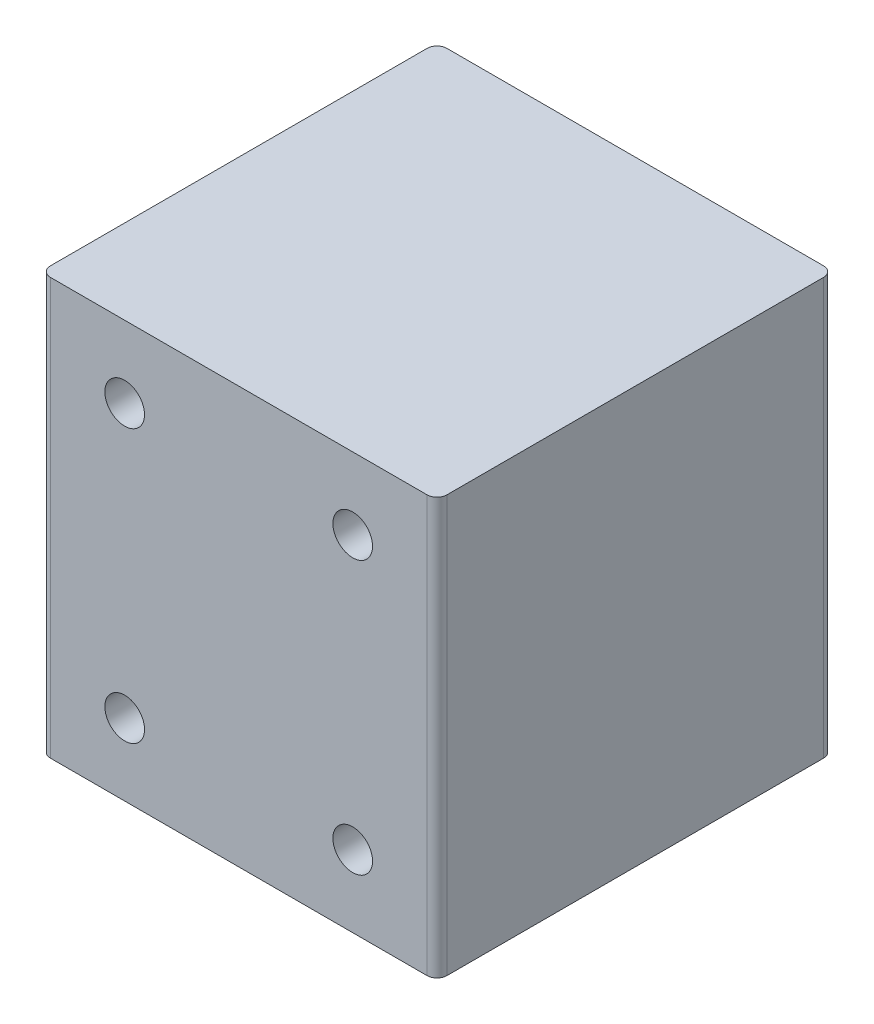
ISO-10303-21;
HEADER;
FILE_DESCRIPTION(('STEP AP214'),'2;1');
FILE_NAME('part.step','',(''),(''),'','','');
FILE_SCHEMA(('AUTOMOTIVE_DESIGN { 1 0 10303 214 1 1 1 1 }'));
ENDSEC;
DATA;
#1=APPLICATION_CONTEXT('core data for automotive mechanical design processes');
#2=APPLICATION_PROTOCOL_DEFINITION('international standard','automotive_design',2000,#1);
#3=PRODUCT_CONTEXT('',#1,'mechanical');
#4=PRODUCT('Part','Part','',(#3));
#5=PRODUCT_RELATED_PRODUCT_CATEGORY('part','',(#4));
#6=PRODUCT_DEFINITION_FORMATION('','',#4);
#7=PRODUCT_DEFINITION_CONTEXT('part definition',#1,'design');
#8=PRODUCT_DEFINITION('design','',#6,#7);
#9=PRODUCT_DEFINITION_SHAPE('','',#8);
#10=(LENGTH_UNIT() NAMED_UNIT(*) SI_UNIT(.MILLI.,.METRE.));
#11=(NAMED_UNIT(*) PLANE_ANGLE_UNIT() SI_UNIT($,.RADIAN.));
#12=(NAMED_UNIT(*) SI_UNIT($,.STERADIAN.) SOLID_ANGLE_UNIT());
#13=UNCERTAINTY_MEASURE_WITH_UNIT(LENGTH_MEASURE(1.E-05),#10,'distance_accuracy_value','');
#14=(GEOMETRIC_REPRESENTATION_CONTEXT(3) GLOBAL_UNCERTAINTY_ASSIGNED_CONTEXT((#13)) GLOBAL_UNIT_ASSIGNED_CONTEXT((#10,
#11,#12)) REPRESENTATION_CONTEXT('',''));
#15=CARTESIAN_POINT('',(0.,0.,0.));
#16=DIRECTION('',(0.,0.,1.));
#17=DIRECTION('',(1.,0.,0.));
#18=AXIS2_PLACEMENT_3D('',#15,#16,#17);
#19=CARTESIAN_POINT('',(40.,84.,40.));
#20=DIRECTION('',(-1.,0.,0.));
#21=DIRECTION('',(0.,0.,1.));
#22=AXIS2_PLACEMENT_3D('',#19,#20,#21);
#23=PLANE('',#22);
#24=DIRECTION('',(0.,0.,-1.));
#25=VECTOR('',#24,1.);
#26=CARTESIAN_POINT('',(40.,0.,40.));
#27=LINE('',#26,#25);
#28=CARTESIAN_POINT('',(40.,0.,38.));
#29=VERTEX_POINT('',#28);
#30=CARTESIAN_POINT('',(40.,0.,-38.));
#31=VERTEX_POINT('',#30);
#32=EDGE_CURVE('E201',#29,#31,#27,.T.);
#33=ORIENTED_EDGE('',*,*,#32,.T.);
#34=DIRECTION('',(0.,-1.,0.));
#35=VECTOR('',#34,1.);
#36=CARTESIAN_POINT('',(40.,84.,-38.));
#37=LINE('',#36,#35);
#38=CARTESIAN_POINT('',(40.,84.,-38.));
#39=VERTEX_POINT('',#38);
#40=EDGE_CURVE('E253',#31,#39,#37,.F.);
#41=ORIENTED_EDGE('',*,*,#40,.T.);
#42=DIRECTION('',(0.,0.,-1.));
#43=VECTOR('',#42,1.);
#44=CARTESIAN_POINT('',(40.,84.,40.));
#45=LINE('',#44,#43);
#46=CARTESIAN_POINT('',(40.,84.,38.));
#47=VERTEX_POINT('',#46);
#48=EDGE_CURVE('E202',#47,#39,#45,.T.);
#49=ORIENTED_EDGE('',*,*,#48,.F.);
#50=DIRECTION('',(0.,-1.,0.));
#51=VECTOR('',#50,1.);
#52=CARTESIAN_POINT('',(40.,84.,38.));
#53=LINE('',#52,#51);
#54=EDGE_CURVE('E249',#47,#29,#53,.T.);
#55=ORIENTED_EDGE('',*,*,#54,.T.);
#56=EDGE_LOOP('',(#33,#41,#49,#55));
#57=FACE_BOUND('',#56,.T.);
#58=ADVANCED_FACE('F40',(#57),#23,.F.);
#59=CARTESIAN_POINT('',(-40.,84.,-40.));
#60=DIRECTION('',(0.,0.,1.));
#61=DIRECTION('',(1.,0.,0.));
#62=AXIS2_PLACEMENT_3D('',#59,#60,#61);
#63=PLANE('',#62);
#64=CARTESIAN_POINT('',(-23.,69.5,-40.));
#65=DIRECTION('',(0.,0.,-1.));
#66=DIRECTION('',(-1.,0.,0.));
#67=AXIS2_PLACEMENT_3D('',#64,#65,#66);
#68=CIRCLE('',#67,3.99999999999999);
#69=CARTESIAN_POINT('',(-27.,69.5,-40.));
#70=VERTEX_POINT('',#69);
#71=EDGE_CURVE('E140',#70,#70,#68,.T.);
#72=ORIENTED_EDGE('',*,*,#71,.F.);
#73=EDGE_LOOP('',(#72));
#74=FACE_BOUND('',#73,.T.);
#75=CARTESIAN_POINT('',(23.,69.5,-40.));
#76=DIRECTION('',(0.,0.,-1.));
#77=DIRECTION('',(-1.,0.,0.));
#78=AXIS2_PLACEMENT_3D('',#75,#76,#77);
#79=CIRCLE('',#78,3.99999999999999);
#80=CARTESIAN_POINT('',(19.,69.5,-40.));
#81=VERTEX_POINT('',#80);
#82=EDGE_CURVE('E139',#81,#81,#79,.T.);
#83=ORIENTED_EDGE('',*,*,#82,.F.);
#84=EDGE_LOOP('',(#83));
#85=FACE_BOUND('',#84,.T.);
#86=CARTESIAN_POINT('',(23.,14.5,-40.));
#87=DIRECTION('',(0.,0.,-1.));
#88=DIRECTION('',(-1.,0.,0.));
#89=AXIS2_PLACEMENT_3D('',#86,#87,#88);
#90=CIRCLE('',#89,3.99999999999999);
#91=CARTESIAN_POINT('',(19.,14.5,-40.));
#92=VERTEX_POINT('',#91);
#93=EDGE_CURVE('E153',#92,#92,#90,.T.);
#94=ORIENTED_EDGE('',*,*,#93,.F.);
#95=EDGE_LOOP('',(#94));
#96=FACE_BOUND('',#95,.T.);
#97=CARTESIAN_POINT('',(-23.,14.5,-40.));
#98=DIRECTION('',(0.,0.,-1.));
#99=DIRECTION('',(-1.,0.,0.));
#100=AXIS2_PLACEMENT_3D('',#97,#98,#99);
#101=CIRCLE('',#100,3.99999999999999);
#102=CARTESIAN_POINT('',(-27.,14.5,-40.));
#103=VERTEX_POINT('',#102);
#104=EDGE_CURVE('E161',#103,#103,#101,.T.);
#105=ORIENTED_EDGE('',*,*,#104,.F.);
#106=EDGE_LOOP('',(#105));
#107=FACE_BOUND('',#106,.T.);
#108=DIRECTION('',(-1.,0.,0.));
#109=VECTOR('',#108,1.);
#110=CARTESIAN_POINT('',(-40.,84.,-40.));
#111=LINE('',#110,#109);
#112=CARTESIAN_POINT('',(38.,84.,-40.));
#113=VERTEX_POINT('',#112);
#114=CARTESIAN_POINT('',(-38.,84.,-40.));
#115=VERTEX_POINT('',#114);
#116=EDGE_CURVE('E206',#113,#115,#111,.T.);
#117=ORIENTED_EDGE('',*,*,#116,.F.);
#118=DIRECTION('',(0.,-1.,0.));
#119=VECTOR('',#118,1.);
#120=CARTESIAN_POINT('',(38.,84.,-40.));
#121=LINE('',#120,#119);
#122=CARTESIAN_POINT('',(38.,0.,-40.));
#123=VERTEX_POINT('',#122);
#124=EDGE_CURVE('E233',#113,#123,#121,.T.);
#125=ORIENTED_EDGE('',*,*,#124,.T.);
#126=DIRECTION('',(-1.,0.,0.));
#127=VECTOR('',#126,1.);
#128=CARTESIAN_POINT('',(-40.,0.,-40.));
#129=LINE('',#128,#127);
#130=CARTESIAN_POINT('',(-38.,0.,-40.));
#131=VERTEX_POINT('',#130);
#132=EDGE_CURVE('E221',#123,#131,#129,.T.);
#133=ORIENTED_EDGE('',*,*,#132,.T.);
#134=DIRECTION('',(0.,-1.,0.));
#135=VECTOR('',#134,1.);
#136=CARTESIAN_POINT('',(-38.,84.,-40.));
#137=LINE('',#136,#135);
#138=EDGE_CURVE('E217',#131,#115,#137,.F.);
#139=ORIENTED_EDGE('',*,*,#138,.T.);
#140=EDGE_LOOP('',(#117,#125,#133,#139));
#141=FACE_BOUND('',#140,.T.);
#142=ADVANCED_FACE('F298',(#74,#85,#96,#107,#141),#63,.F.);
#143=CARTESIAN_POINT('',(-40.,84.,40.));
#144=DIRECTION('',(1.,0.,0.));
#145=DIRECTION('',(0.,0.,-1.));
#146=AXIS2_PLACEMENT_3D('',#143,#144,#145);
#147=PLANE('',#146);
#148=DIRECTION('',(0.,0.,1.));
#149=VECTOR('',#148,1.);
#150=CARTESIAN_POINT('',(-40.,84.,40.));
#151=LINE('',#150,#149);
#152=CARTESIAN_POINT('',(-40.,84.,-38.));
#153=VERTEX_POINT('',#152);
#154=CARTESIAN_POINT('',(-40.,84.,38.));
#155=VERTEX_POINT('',#154);
#156=EDGE_CURVE('E211',#153,#155,#151,.T.);
#157=ORIENTED_EDGE('',*,*,#156,.F.);
#158=DIRECTION('',(0.,-1.,0.));
#159=VECTOR('',#158,1.);
#160=CARTESIAN_POINT('',(-40.,84.,-38.));
#161=LINE('',#160,#159);
#162=CARTESIAN_POINT('',(-40.,0.,-38.));
#163=VERTEX_POINT('',#162);
#164=EDGE_CURVE('E270',#153,#163,#161,.T.);
#165=ORIENTED_EDGE('',*,*,#164,.T.);
#166=DIRECTION('',(0.,0.,1.));
#167=VECTOR('',#166,1.);
#168=CARTESIAN_POINT('',(-40.,0.,40.));
#169=LINE('',#168,#167);
#170=CARTESIAN_POINT('',(-40.,0.,38.));
#171=VERTEX_POINT('',#170);
#172=EDGE_CURVE('E225',#163,#171,#169,.T.);
#173=ORIENTED_EDGE('',*,*,#172,.T.);
#174=DIRECTION('',(0.,-1.,0.));
#175=VECTOR('',#174,1.);
#176=CARTESIAN_POINT('',(-40.,84.,38.));
#177=LINE('',#176,#175);
#178=EDGE_CURVE('E267',#171,#155,#177,.F.);
#179=ORIENTED_EDGE('',*,*,#178,.T.);
#180=EDGE_LOOP('',(#157,#165,#173,#179));
#181=FACE_BOUND('',#180,.T.);
#182=ADVANCED_FACE('F306',(#181),#147,.F.);
#183=CARTESIAN_POINT('',(-40.,84.,40.));
#184=DIRECTION('',(0.,0.,-1.));
#185=DIRECTION('',(-1.,0.,0.));
#186=AXIS2_PLACEMENT_3D('',#183,#184,#185);
#187=PLANE('',#186);
#188=CARTESIAN_POINT('',(-23.,69.5,40.));
#189=DIRECTION('',(0.,0.,1.));
#190=DIRECTION('',(1.,0.,0.));
#191=AXIS2_PLACEMENT_3D('',#188,#189,#190);
#192=CIRCLE('',#191,3.99999999999999);
#193=CARTESIAN_POINT('',(-19.,69.5,40.));
#194=VERTEX_POINT('',#193);
#195=EDGE_CURVE('E169',#194,#194,#192,.T.);
#196=ORIENTED_EDGE('',*,*,#195,.F.);
#197=EDGE_LOOP('',(#196));
#198=FACE_BOUND('',#197,.T.);
#199=CARTESIAN_POINT('',(23.,69.5,40.));
#200=DIRECTION('',(0.,0.,1.));
#201=DIRECTION('',(1.,0.,0.));
#202=AXIS2_PLACEMENT_3D('',#199,#200,#201);
#203=CIRCLE('',#202,3.99999999999999);
#204=CARTESIAN_POINT('',(27.,69.5,40.));
#205=VERTEX_POINT('',#204);
#206=EDGE_CURVE('E177',#205,#205,#203,.T.);
#207=ORIENTED_EDGE('',*,*,#206,.F.);
#208=EDGE_LOOP('',(#207));
#209=FACE_BOUND('',#208,.T.);
#210=CARTESIAN_POINT('',(23.,14.5,40.));
#211=DIRECTION('',(0.,0.,1.));
#212=DIRECTION('',(1.,0.,0.));
#213=AXIS2_PLACEMENT_3D('',#210,#211,#212);
#214=CIRCLE('',#213,3.99999999999999);
#215=CARTESIAN_POINT('',(27.,14.5,40.));
#216=VERTEX_POINT('',#215);
#217=EDGE_CURVE('E185',#216,#216,#214,.T.);
#218=ORIENTED_EDGE('',*,*,#217,.F.);
#219=EDGE_LOOP('',(#218));
#220=FACE_BOUND('',#219,.T.);
#221=CARTESIAN_POINT('',(-23.,14.5,40.));
#222=DIRECTION('',(0.,0.,1.));
#223=DIRECTION('',(1.,0.,0.));
#224=AXIS2_PLACEMENT_3D('',#221,#222,#223);
#225=CIRCLE('',#224,3.99999999999999);
#226=CARTESIAN_POINT('',(-19.,14.5,40.));
#227=VERTEX_POINT('',#226);
#228=EDGE_CURVE('E193',#227,#227,#225,.T.);
#229=ORIENTED_EDGE('',*,*,#228,.F.);
#230=EDGE_LOOP('',(#229));
#231=FACE_BOUND('',#230,.T.);
#232=DIRECTION('',(1.,0.,0.));
#233=VECTOR('',#232,1.);
#234=CARTESIAN_POINT('',(-40.,0.,40.));
#235=LINE('',#234,#233);
#236=CARTESIAN_POINT('',(-38.,0.,40.));
#237=VERTEX_POINT('',#236);
#238=CARTESIAN_POINT('',(38.,0.,40.));
#239=VERTEX_POINT('',#238);
#240=EDGE_CURVE('E207',#237,#239,#235,.T.);
#241=ORIENTED_EDGE('',*,*,#240,.T.);
#242=DIRECTION('',(0.,-1.,0.));
#243=VECTOR('',#242,1.);
#244=CARTESIAN_POINT('',(38.,84.,40.));
#245=LINE('',#244,#243);
#246=CARTESIAN_POINT('',(38.,84.,40.));
#247=VERTEX_POINT('',#246);
#248=EDGE_CURVE('E11',#239,#247,#245,.F.);
#249=ORIENTED_EDGE('',*,*,#248,.T.);
#250=DIRECTION('',(1.,0.,0.));
#251=VECTOR('',#250,1.);
#252=CARTESIAN_POINT('',(-40.,84.,40.));
#253=LINE('',#252,#251);
#254=CARTESIAN_POINT('',(-38.,84.,40.));
#255=VERTEX_POINT('',#254);
#256=EDGE_CURVE('E214',#255,#247,#253,.T.);
#257=ORIENTED_EDGE('',*,*,#256,.F.);
#258=DIRECTION('',(0.,-1.,0.));
#259=VECTOR('',#258,1.);
#260=CARTESIAN_POINT('',(-38.,84.,40.));
#261=LINE('',#260,#259);
#262=EDGE_CURVE('E49',#255,#237,#261,.T.);
#263=ORIENTED_EDGE('',*,*,#262,.T.);
#264=EDGE_LOOP('',(#241,#249,#257,#263));
#265=FACE_BOUND('',#264,.T.);
#266=ADVANCED_FACE('F277',(#198,#209,#220,#231,#265),#187,.F.);
#267=CARTESIAN_POINT('',(0.,84.,0.));
#268=DIRECTION('',(0.,-1.,0.));
#269=DIRECTION('',(0.,0.,-1.));
#270=AXIS2_PLACEMENT_3D('',#267,#268,#269);
#271=PLANE('',#270);
#272=ORIENTED_EDGE('',*,*,#48,.T.);
#273=CARTESIAN_POINT('',(38.,84.,-38.));
#274=DIRECTION('',(0.,-1.,0.));
#275=DIRECTION('',(0.,0.,-1.));
#276=AXIS2_PLACEMENT_3D('',#273,#274,#275);
#277=CIRCLE('',#276,2.);
#278=EDGE_CURVE('E264',#39,#113,#277,.F.);
#279=ORIENTED_EDGE('',*,*,#278,.T.);
#280=ORIENTED_EDGE('',*,*,#116,.T.);
#281=CARTESIAN_POINT('',(-38.,84.,-38.));
#282=DIRECTION('',(0.,-1.,0.));
#283=DIRECTION('',(0.,0.,-1.));
#284=AXIS2_PLACEMENT_3D('',#281,#282,#283);
#285=CIRCLE('',#284,2.);
#286=EDGE_CURVE('E261',#115,#153,#285,.F.);
#287=ORIENTED_EDGE('',*,*,#286,.T.);
#288=ORIENTED_EDGE('',*,*,#156,.T.);
#289=CARTESIAN_POINT('',(-38.,84.,38.));
#290=DIRECTION('',(0.,-1.,0.));
#291=DIRECTION('',(0.,0.,-1.));
#292=AXIS2_PLACEMENT_3D('',#289,#290,#291);
#293=CIRCLE('',#292,2.);
#294=EDGE_CURVE('E61',#155,#255,#293,.F.);
#295=ORIENTED_EDGE('',*,*,#294,.T.);
#296=ORIENTED_EDGE('',*,*,#256,.T.);
#297=CARTESIAN_POINT('',(38.,84.,38.));
#298=DIRECTION('',(0.,-1.,0.));
#299=DIRECTION('',(0.,0.,-1.));
#300=AXIS2_PLACEMENT_3D('',#297,#298,#299);
#301=CIRCLE('',#300,2.);
#302=EDGE_CURVE('E258',#247,#47,#301,.F.);
#303=ORIENTED_EDGE('',*,*,#302,.T.);
#304=EDGE_LOOP('',(#272,#279,#280,#287,#288,#295,#296,#303));
#305=FACE_BOUND('',#304,.T.);
#306=ADVANCED_FACE('F292',(#305),#271,.F.);
#307=CARTESIAN_POINT('',(0.,0.,0.));
#308=DIRECTION('',(0.,-1.,0.));
#309=DIRECTION('',(0.,0.,-1.));
#310=AXIS2_PLACEMENT_3D('',#307,#308,#309);
#311=PLANE('',#310);
#312=ORIENTED_EDGE('',*,*,#132,.F.);
#313=CARTESIAN_POINT('',(38.,0.,-38.));
#314=DIRECTION('',(0.,-1.,0.));
#315=DIRECTION('',(0.,0.,-1.));
#316=AXIS2_PLACEMENT_3D('',#313,#314,#315);
#317=CIRCLE('',#316,2.);
#318=EDGE_CURVE('E246',#123,#31,#317,.T.);
#319=ORIENTED_EDGE('',*,*,#318,.T.);
#320=ORIENTED_EDGE('',*,*,#32,.F.);
#321=CARTESIAN_POINT('',(38.,0.,38.));
#322=DIRECTION('',(0.,-1.,0.));
#323=DIRECTION('',(0.,0.,-1.));
#324=AXIS2_PLACEMENT_3D('',#321,#322,#323);
#325=CIRCLE('',#324,2.);
#326=EDGE_CURVE('E240',#29,#239,#325,.T.);
#327=ORIENTED_EDGE('',*,*,#326,.T.);
#328=ORIENTED_EDGE('',*,*,#240,.F.);
#329=CARTESIAN_POINT('',(-38.,0.,38.));
#330=DIRECTION('',(0.,-1.,0.));
#331=DIRECTION('',(0.,0.,-1.));
#332=AXIS2_PLACEMENT_3D('',#329,#330,#331);
#333=CIRCLE('',#332,2.);
#334=EDGE_CURVE('E237',#237,#171,#333,.T.);
#335=ORIENTED_EDGE('',*,*,#334,.T.);
#336=ORIENTED_EDGE('',*,*,#172,.F.);
#337=CARTESIAN_POINT('',(-38.,0.,-38.));
#338=DIRECTION('',(0.,-1.,0.));
#339=DIRECTION('',(0.,0.,-1.));
#340=AXIS2_PLACEMENT_3D('',#337,#338,#339);
#341=CIRCLE('',#340,2.);
#342=EDGE_CURVE('E243',#163,#131,#341,.T.);
#343=ORIENTED_EDGE('',*,*,#342,.T.);
#344=EDGE_LOOP('',(#312,#319,#320,#327,#328,#335,#336,#343));
#345=FACE_BOUND('',#344,.T.);
#346=ADVANCED_FACE('F281',(#345),#311,.T.);
#347=CARTESIAN_POINT('',(-23.,14.5,28.));
#348=DIRECTION('',(0.,0.,1.));
#349=DIRECTION('',(1.,0.,0.));
#350=AXIS2_PLACEMENT_3D('',#347,#348,#349);
#351=CONICAL_SURFACE('',#350,3.99999999999999,1.02974425867665);
#352=CARTESIAN_POINT('',(-23.,14.5,25.5965575238898));
#353=VERTEX_POINT('',#352);
#354=VERTEX_LOOP('',#353);
#355=FACE_BOUND('',#354,.T.);
#356=CARTESIAN_POINT('',(-23.,14.5,28.));
#357=DIRECTION('',(0.,0.,1.));
#358=DIRECTION('',(1.,0.,0.));
#359=AXIS2_PLACEMENT_3D('',#356,#357,#358);
#360=CIRCLE('',#359,3.99999999999999);
#361=CARTESIAN_POINT('',(-19.,14.5,28.));
#362=VERTEX_POINT('',#361);
#363=EDGE_CURVE('E197',#362,#362,#360,.T.);
#364=ORIENTED_EDGE('',*,*,#363,.T.);
#365=EDGE_LOOP('',(#364));
#366=FACE_BOUND('',#365,.T.);
#367=ADVANCED_FACE('F480',(#355,#366),#351,.F.);
#368=CARTESIAN_POINT('',(-23.,14.5,40.));
#369=DIRECTION('',(0.,0.,1.));
#370=DIRECTION('',(1.,0.,0.));
#371=AXIS2_PLACEMENT_3D('',#368,#369,#370);
#372=CYLINDRICAL_SURFACE('',#371,3.99999999999999);
#373=ORIENTED_EDGE('',*,*,#363,.F.);
#374=EDGE_LOOP('',(#373));
#375=FACE_BOUND('',#374,.T.);
#376=ORIENTED_EDGE('',*,*,#228,.T.);
#377=EDGE_LOOP('',(#376));
#378=FACE_BOUND('',#377,.T.);
#379=ADVANCED_FACE('F471',(#375,#378),#372,.F.);
#380=CARTESIAN_POINT('',(23.,14.5,28.));
#381=DIRECTION('',(0.,0.,1.));
#382=DIRECTION('',(1.,0.,0.));
#383=AXIS2_PLACEMENT_3D('',#380,#381,#382);
#384=CONICAL_SURFACE('',#383,3.99999999999999,1.02974425867665);
#385=CARTESIAN_POINT('',(23.,14.5,25.5965575238898));
#386=VERTEX_POINT('',#385);
#387=VERTEX_LOOP('',#386);
#388=FACE_BOUND('',#387,.T.);
#389=CARTESIAN_POINT('',(23.,14.5,28.));
#390=DIRECTION('',(0.,0.,1.));
#391=DIRECTION('',(1.,0.,0.));
#392=AXIS2_PLACEMENT_3D('',#389,#390,#391);
#393=CIRCLE('',#392,3.99999999999999);
#394=CARTESIAN_POINT('',(27.,14.5,28.));
#395=VERTEX_POINT('',#394);
#396=EDGE_CURVE('E189',#395,#395,#393,.T.);
#397=ORIENTED_EDGE('',*,*,#396,.T.);
#398=EDGE_LOOP('',(#397));
#399=FACE_BOUND('',#398,.T.);
#400=ADVANCED_FACE('F461',(#388,#399),#384,.F.);
#401=CARTESIAN_POINT('',(23.,14.5,40.));
#402=DIRECTION('',(0.,0.,1.));
#403=DIRECTION('',(1.,0.,0.));
#404=AXIS2_PLACEMENT_3D('',#401,#402,#403);
#405=CYLINDRICAL_SURFACE('',#404,3.99999999999999);
#406=ORIENTED_EDGE('',*,*,#396,.F.);
#407=EDGE_LOOP('',(#406));
#408=FACE_BOUND('',#407,.T.);
#409=ORIENTED_EDGE('',*,*,#217,.T.);
#410=EDGE_LOOP('',(#409));
#411=FACE_BOUND('',#410,.T.);
#412=ADVANCED_FACE('F452',(#408,#411),#405,.F.);
#413=CARTESIAN_POINT('',(23.,69.5,28.));
#414=DIRECTION('',(0.,0.,1.));
#415=DIRECTION('',(1.,0.,0.));
#416=AXIS2_PLACEMENT_3D('',#413,#414,#415);
#417=CONICAL_SURFACE('',#416,3.99999999999999,1.02974425867665);
#418=CARTESIAN_POINT('',(23.,69.5,25.5965575238898));
#419=VERTEX_POINT('',#418);
#420=VERTEX_LOOP('',#419);
#421=FACE_BOUND('',#420,.T.);
#422=CARTESIAN_POINT('',(23.,69.5,28.));
#423=DIRECTION('',(0.,0.,1.));
#424=DIRECTION('',(1.,0.,0.));
#425=AXIS2_PLACEMENT_3D('',#422,#423,#424);
#426=CIRCLE('',#425,3.99999999999999);
#427=CARTESIAN_POINT('',(27.,69.5,28.));
#428=VERTEX_POINT('',#427);
#429=EDGE_CURVE('E181',#428,#428,#426,.T.);
#430=ORIENTED_EDGE('',*,*,#429,.T.);
#431=EDGE_LOOP('',(#430));
#432=FACE_BOUND('',#431,.T.);
#433=ADVANCED_FACE('F442',(#421,#432),#417,.F.);
#434=CARTESIAN_POINT('',(23.,69.5,40.));
#435=DIRECTION('',(0.,0.,1.));
#436=DIRECTION('',(1.,0.,0.));
#437=AXIS2_PLACEMENT_3D('',#434,#435,#436);
#438=CYLINDRICAL_SURFACE('',#437,3.99999999999999);
#439=ORIENTED_EDGE('',*,*,#429,.F.);
#440=EDGE_LOOP('',(#439));
#441=FACE_BOUND('',#440,.T.);
#442=ORIENTED_EDGE('',*,*,#206,.T.);
#443=EDGE_LOOP('',(#442));
#444=FACE_BOUND('',#443,.T.);
#445=ADVANCED_FACE('F433',(#441,#444),#438,.F.);
#446=CARTESIAN_POINT('',(-23.,69.5,28.));
#447=DIRECTION('',(0.,0.,1.));
#448=DIRECTION('',(1.,0.,0.));
#449=AXIS2_PLACEMENT_3D('',#446,#447,#448);
#450=CONICAL_SURFACE('',#449,3.99999999999999,1.02974425867665);
#451=CARTESIAN_POINT('',(-23.,69.5,25.5965575238898));
#452=VERTEX_POINT('',#451);
#453=VERTEX_LOOP('',#452);
#454=FACE_BOUND('',#453,.T.);
#455=CARTESIAN_POINT('',(-23.,69.5,28.));
#456=DIRECTION('',(0.,0.,1.));
#457=DIRECTION('',(1.,0.,0.));
#458=AXIS2_PLACEMENT_3D('',#455,#456,#457);
#459=CIRCLE('',#458,3.99999999999999);
#460=CARTESIAN_POINT('',(-19.,69.5,28.));
#461=VERTEX_POINT('',#460);
#462=EDGE_CURVE('E173',#461,#461,#459,.T.);
#463=ORIENTED_EDGE('',*,*,#462,.T.);
#464=EDGE_LOOP('',(#463));
#465=FACE_BOUND('',#464,.T.);
#466=ADVANCED_FACE('F423',(#454,#465),#450,.F.);
#467=CARTESIAN_POINT('',(-23.,69.5,40.));
#468=DIRECTION('',(0.,0.,1.));
#469=DIRECTION('',(1.,0.,0.));
#470=AXIS2_PLACEMENT_3D('',#467,#468,#469);
#471=CYLINDRICAL_SURFACE('',#470,3.99999999999999);
#472=ORIENTED_EDGE('',*,*,#462,.F.);
#473=EDGE_LOOP('',(#472));
#474=FACE_BOUND('',#473,.T.);
#475=ORIENTED_EDGE('',*,*,#195,.T.);
#476=EDGE_LOOP('',(#475));
#477=FACE_BOUND('',#476,.T.);
#478=ADVANCED_FACE('F414',(#474,#477),#471,.F.);
#479=CARTESIAN_POINT('',(-23.,14.5,-28.));
#480=DIRECTION('',(0.,0.,-1.));
#481=DIRECTION('',(-1.,0.,0.));
#482=AXIS2_PLACEMENT_3D('',#479,#480,#481);
#483=CONICAL_SURFACE('',#482,3.99999999999999,1.02974425867665);
#484=CARTESIAN_POINT('',(-23.,14.5,-25.5965575238898));
#485=VERTEX_POINT('',#484);
#486=VERTEX_LOOP('',#485);
#487=FACE_BOUND('',#486,.T.);
#488=CARTESIAN_POINT('',(-23.,14.5,-28.));
#489=DIRECTION('',(0.,0.,-1.));
#490=DIRECTION('',(-1.,0.,0.));
#491=AXIS2_PLACEMENT_3D('',#488,#489,#490);
#492=CIRCLE('',#491,3.99999999999999);
#493=CARTESIAN_POINT('',(-27.,14.5,-28.));
#494=VERTEX_POINT('',#493);
#495=EDGE_CURVE('E165',#494,#494,#492,.T.);
#496=ORIENTED_EDGE('',*,*,#495,.T.);
#497=EDGE_LOOP('',(#496));
#498=FACE_BOUND('',#497,.T.);
#499=ADVANCED_FACE('F404',(#487,#498),#483,.F.);
#500=CARTESIAN_POINT('',(-23.,14.5,-40.));
#501=DIRECTION('',(0.,0.,-1.));
#502=DIRECTION('',(-1.,0.,0.));
#503=AXIS2_PLACEMENT_3D('',#500,#501,#502);
#504=CYLINDRICAL_SURFACE('',#503,3.99999999999999);
#505=ORIENTED_EDGE('',*,*,#495,.F.);
#506=EDGE_LOOP('',(#505));
#507=FACE_BOUND('',#506,.T.);
#508=ORIENTED_EDGE('',*,*,#104,.T.);
#509=EDGE_LOOP('',(#508));
#510=FACE_BOUND('',#509,.T.);
#511=ADVANCED_FACE('F395',(#507,#510),#504,.F.);
#512=CARTESIAN_POINT('',(23.,14.5,-28.));
#513=DIRECTION('',(0.,0.,-1.));
#514=DIRECTION('',(-1.,0.,0.));
#515=AXIS2_PLACEMENT_3D('',#512,#513,#514);
#516=CONICAL_SURFACE('',#515,3.99999999999999,1.02974425867665);
#517=CARTESIAN_POINT('',(23.,14.5,-25.5965575238898));
#518=VERTEX_POINT('',#517);
#519=VERTEX_LOOP('',#518);
#520=FACE_BOUND('',#519,.T.);
#521=CARTESIAN_POINT('',(23.,14.5,-28.));
#522=DIRECTION('',(0.,0.,-1.));
#523=DIRECTION('',(-1.,0.,0.));
#524=AXIS2_PLACEMENT_3D('',#521,#522,#523);
#525=CIRCLE('',#524,3.99999999999999);
#526=CARTESIAN_POINT('',(19.,14.5,-28.));
#527=VERTEX_POINT('',#526);
#528=EDGE_CURVE('E157',#527,#527,#525,.T.);
#529=ORIENTED_EDGE('',*,*,#528,.T.);
#530=EDGE_LOOP('',(#529));
#531=FACE_BOUND('',#530,.T.);
#532=ADVANCED_FACE('F385',(#520,#531),#516,.F.);
#533=CARTESIAN_POINT('',(23.,14.5,-40.));
#534=DIRECTION('',(0.,0.,-1.));
#535=DIRECTION('',(-1.,0.,0.));
#536=AXIS2_PLACEMENT_3D('',#533,#534,#535);
#537=CYLINDRICAL_SURFACE('',#536,3.99999999999999);
#538=ORIENTED_EDGE('',*,*,#528,.F.);
#539=EDGE_LOOP('',(#538));
#540=FACE_BOUND('',#539,.T.);
#541=ORIENTED_EDGE('',*,*,#93,.T.);
#542=EDGE_LOOP('',(#541));
#543=FACE_BOUND('',#542,.T.);
#544=ADVANCED_FACE('F376',(#540,#543),#537,.F.);
#545=CARTESIAN_POINT('',(23.,69.5,-28.));
#546=DIRECTION('',(0.,0.,-1.));
#547=DIRECTION('',(-1.,0.,0.));
#548=AXIS2_PLACEMENT_3D('',#545,#546,#547);
#549=CONICAL_SURFACE('',#548,3.99999999999999,1.02974425867665);
#550=CARTESIAN_POINT('',(23.,69.5,-25.5965575238898));
#551=VERTEX_POINT('',#550);
#552=VERTEX_LOOP('',#551);
#553=FACE_BOUND('',#552,.T.);
#554=CARTESIAN_POINT('',(23.,69.5,-28.));
#555=DIRECTION('',(0.,0.,-1.));
#556=DIRECTION('',(-1.,0.,0.));
#557=AXIS2_PLACEMENT_3D('',#554,#555,#556);
#558=CIRCLE('',#557,3.99999999999999);
#559=CARTESIAN_POINT('',(19.,69.5,-28.));
#560=VERTEX_POINT('',#559);
#561=EDGE_CURVE('E145',#560,#560,#558,.T.);
#562=ORIENTED_EDGE('',*,*,#561,.T.);
#563=EDGE_LOOP('',(#562));
#564=FACE_BOUND('',#563,.T.);
#565=ADVANCED_FACE('F366',(#553,#564),#549,.F.);
#566=CARTESIAN_POINT('',(23.,69.5,-40.));
#567=DIRECTION('',(0.,0.,-1.));
#568=DIRECTION('',(-1.,0.,0.));
#569=AXIS2_PLACEMENT_3D('',#566,#567,#568);
#570=CYLINDRICAL_SURFACE('',#569,3.99999999999999);
#571=ORIENTED_EDGE('',*,*,#561,.F.);
#572=EDGE_LOOP('',(#571));
#573=FACE_BOUND('',#572,.T.);
#574=ORIENTED_EDGE('',*,*,#82,.T.);
#575=EDGE_LOOP('',(#574));
#576=FACE_BOUND('',#575,.T.);
#577=ADVANCED_FACE('F132',(#573,#576),#570,.F.);
#578=CARTESIAN_POINT('',(-23.,69.5,-28.));
#579=DIRECTION('',(0.,0.,-1.));
#580=DIRECTION('',(-1.,0.,0.));
#581=AXIS2_PLACEMENT_3D('',#578,#579,#580);
#582=CONICAL_SURFACE('',#581,3.99999999999999,1.02974425867665);
#583=CARTESIAN_POINT('',(-23.,69.5,-25.5965575238898));
#584=VERTEX_POINT('',#583);
#585=VERTEX_LOOP('',#584);
#586=FACE_BOUND('',#585,.T.);
#587=CARTESIAN_POINT('',(-23.,69.5,-28.));
#588=DIRECTION('',(0.,0.,-1.));
#589=DIRECTION('',(-1.,0.,0.));
#590=AXIS2_PLACEMENT_3D('',#587,#588,#589);
#591=CIRCLE('',#590,3.99999999999999);
#592=CARTESIAN_POINT('',(-27.,69.5,-28.));
#593=VERTEX_POINT('',#592);
#594=EDGE_CURVE('E136',#593,#593,#591,.T.);
#595=ORIENTED_EDGE('',*,*,#594,.T.);
#596=EDGE_LOOP('',(#595));
#597=FACE_BOUND('',#596,.T.);
#598=ADVANCED_FACE('F128',(#586,#597),#582,.F.);
#599=CARTESIAN_POINT('',(-23.,69.5,-40.));
#600=DIRECTION('',(0.,0.,-1.));
#601=DIRECTION('',(-1.,0.,0.));
#602=AXIS2_PLACEMENT_3D('',#599,#600,#601);
#603=CYLINDRICAL_SURFACE('',#602,3.99999999999999);
#604=ORIENTED_EDGE('',*,*,#594,.F.);
#605=EDGE_LOOP('',(#604));
#606=FACE_BOUND('',#605,.T.);
#607=ORIENTED_EDGE('',*,*,#71,.T.);
#608=EDGE_LOOP('',(#607));
#609=FACE_BOUND('',#608,.T.);
#610=ADVANCED_FACE('F131',(#606,#609),#603,.F.);
#611=CARTESIAN_POINT('',(38.,84.,-38.));
#612=DIRECTION('',(0.,-1.,0.));
#613=DIRECTION('',(0.,0.,-1.));
#614=AXIS2_PLACEMENT_3D('',#611,#612,#613);
#615=CYLINDRICAL_SURFACE('',#614,2.);
#616=ORIENTED_EDGE('',*,*,#278,.F.);
#617=ORIENTED_EDGE('',*,*,#40,.F.);
#618=ORIENTED_EDGE('',*,*,#318,.F.);
#619=ORIENTED_EDGE('',*,*,#124,.F.);
#620=EDGE_LOOP('',(#616,#617,#618,#619));
#621=FACE_BOUND('',#620,.T.);
#622=ADVANCED_FACE('F296',(#621),#615,.T.);
#623=CARTESIAN_POINT('',(-38.,84.,-38.));
#624=DIRECTION('',(0.,-1.,0.));
#625=DIRECTION('',(0.,0.,-1.));
#626=AXIS2_PLACEMENT_3D('',#623,#624,#625);
#627=CYLINDRICAL_SURFACE('',#626,2.);
#628=ORIENTED_EDGE('',*,*,#286,.F.);
#629=ORIENTED_EDGE('',*,*,#138,.F.);
#630=ORIENTED_EDGE('',*,*,#342,.F.);
#631=ORIENTED_EDGE('',*,*,#164,.F.);
#632=EDGE_LOOP('',(#628,#629,#630,#631));
#633=FACE_BOUND('',#632,.T.);
#634=ADVANCED_FACE('F303',(#633),#627,.T.);
#635=CARTESIAN_POINT('',(38.,84.,38.));
#636=DIRECTION('',(0.,-1.,0.));
#637=DIRECTION('',(0.,0.,-1.));
#638=AXIS2_PLACEMENT_3D('',#635,#636,#637);
#639=CYLINDRICAL_SURFACE('',#638,2.);
#640=ORIENTED_EDGE('',*,*,#302,.F.);
#641=ORIENTED_EDGE('',*,*,#248,.F.);
#642=ORIENTED_EDGE('',*,*,#326,.F.);
#643=ORIENTED_EDGE('',*,*,#54,.F.);
#644=EDGE_LOOP('',(#640,#641,#642,#643));
#645=FACE_BOUND('',#644,.T.);
#646=ADVANCED_FACE('F287',(#645),#639,.T.);
#647=CARTESIAN_POINT('',(-38.,84.,38.));
#648=DIRECTION('',(0.,-1.,0.));
#649=DIRECTION('',(0.,0.,-1.));
#650=AXIS2_PLACEMENT_3D('',#647,#648,#649);
#651=CYLINDRICAL_SURFACE('',#650,2.);
#652=ORIENTED_EDGE('',*,*,#294,.F.);
#653=ORIENTED_EDGE('',*,*,#178,.F.);
#654=ORIENTED_EDGE('',*,*,#334,.F.);
#655=ORIENTED_EDGE('',*,*,#262,.F.);
#656=EDGE_LOOP('',(#652,#653,#654,#655));
#657=FACE_BOUND('',#656,.T.);
#658=ADVANCED_FACE('F42',(#657),#651,.T.);
#659=CLOSED_SHELL('',(#58,#142,#182,#266,#306,#346,#367,#379,#400,#412,#433,#445,#466,#478,#499,
#511,#532,#544,#565,#577,#598,#610,#622,#634,#646,#658));
#660=MANIFOLD_SOLID_BREP('B2',#659);
#661=ADVANCED_BREP_SHAPE_REPRESENTATION('',(#18,#660),#14);
#662=SHAPE_DEFINITION_REPRESENTATION(#9,#661);
ENDSEC;
END-ISO-10303-21;
